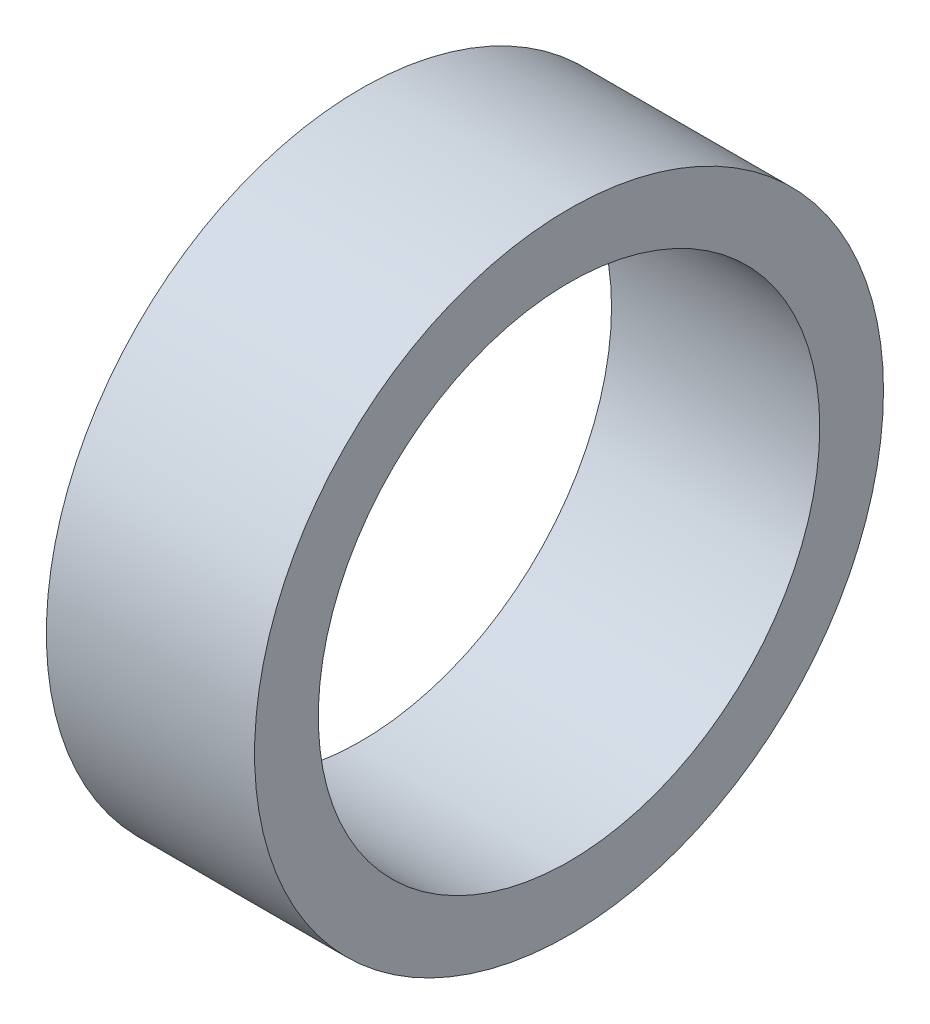
ISO-10303-21;
HEADER;
FILE_DESCRIPTION(('STEP AP214'),'2;1');
FILE_NAME('part.step','',(''),(''),'','','');
FILE_SCHEMA(('AUTOMOTIVE_DESIGN { 1 0 10303 214 1 1 1 1 }'));
ENDSEC;
DATA;
#1=APPLICATION_CONTEXT('core data for automotive mechanical design processes');
#2=APPLICATION_PROTOCOL_DEFINITION('international standard','automotive_design',2000,#1);
#3=PRODUCT_CONTEXT('',#1,'mechanical');
#4=PRODUCT('Part','Part','',(#3));
#5=PRODUCT_RELATED_PRODUCT_CATEGORY('part','',(#4));
#6=PRODUCT_DEFINITION_FORMATION('','',#4);
#7=PRODUCT_DEFINITION_CONTEXT('part definition',#1,'design');
#8=PRODUCT_DEFINITION('design','',#6,#7);
#9=PRODUCT_DEFINITION_SHAPE('','',#8);
#10=(LENGTH_UNIT() NAMED_UNIT(*) SI_UNIT(.MILLI.,.METRE.));
#11=(NAMED_UNIT(*) PLANE_ANGLE_UNIT() SI_UNIT($,.RADIAN.));
#12=(NAMED_UNIT(*) SI_UNIT($,.STERADIAN.) SOLID_ANGLE_UNIT());
#13=UNCERTAINTY_MEASURE_WITH_UNIT(LENGTH_MEASURE(1.E-05),#10,'distance_accuracy_value','');
#14=(GEOMETRIC_REPRESENTATION_CONTEXT(3) GLOBAL_UNCERTAINTY_ASSIGNED_CONTEXT((#13)) GLOBAL_UNIT_ASSIGNED_CONTEXT((#10,
#11,#12)) REPRESENTATION_CONTEXT('',''));
#15=CARTESIAN_POINT('',(0.,0.,0.));
#16=DIRECTION('',(0.,0.,1.));
#17=DIRECTION('',(1.,0.,0.));
#18=AXIS2_PLACEMENT_3D('',#15,#16,#17);
#19=CARTESIAN_POINT('',(2.4892,0.,0.));
#20=DIRECTION('',(1.,0.,0.));
#21=DIRECTION('',(0.,0.,-1.));
#22=AXIS2_PLACEMENT_3D('',#19,#20,#21);
#23=PLANE('',#22);
#24=CARTESIAN_POINT('',(2.4892,0.,0.));
#25=DIRECTION('',(1.,0.,0.));
#26=DIRECTION('',(0.,0.,-1.));
#27=AXIS2_PLACEMENT_3D('',#24,#25,#26);
#28=CIRCLE('',#27,3.7592);
#29=CARTESIAN_POINT('',(2.4892,0.,-3.7592));
#30=VERTEX_POINT('',#29);
#31=EDGE_CURVE('E10',#30,#30,#28,.T.);
#32=ORIENTED_EDGE('',*,*,#31,.T.);
#33=EDGE_LOOP('',(#32));
#34=FACE_BOUND('',#33,.T.);
#35=CARTESIAN_POINT('',(2.4892,0.,0.));
#36=DIRECTION('',(1.,0.,0.));
#37=DIRECTION('',(0.,0.,-1.));
#38=AXIS2_PLACEMENT_3D('',#35,#36,#37);
#39=CIRCLE('',#38,2.9972);
#40=CARTESIAN_POINT('',(2.4892,0.,-2.9972));
#41=VERTEX_POINT('',#40);
#42=EDGE_CURVE('E50',#41,#41,#39,.T.);
#43=ORIENTED_EDGE('',*,*,#42,.F.);
#44=EDGE_LOOP('',(#43));
#45=FACE_BOUND('',#44,.T.);
#46=ADVANCED_FACE('F39',(#34,#45),#23,.T.);
#47=CARTESIAN_POINT('',(0.,0.,0.));
#48=DIRECTION('',(1.,0.,0.));
#49=DIRECTION('',(0.,0.,-1.));
#50=AXIS2_PLACEMENT_3D('',#47,#48,#49);
#51=PLANE('',#50);
#52=CARTESIAN_POINT('',(0.,0.,0.));
#53=DIRECTION('',(1.,0.,0.));
#54=DIRECTION('',(0.,0.,-1.));
#55=AXIS2_PLACEMENT_3D('',#52,#53,#54);
#56=CIRCLE('',#55,3.7592);
#57=CARTESIAN_POINT('',(0.,0.,-3.7592));
#58=VERTEX_POINT('',#57);
#59=EDGE_CURVE('E43',#58,#58,#56,.T.);
#60=ORIENTED_EDGE('',*,*,#59,.F.);
#61=EDGE_LOOP('',(#60));
#62=FACE_BOUND('',#61,.T.);
#63=CARTESIAN_POINT('',(0.,0.,0.));
#64=DIRECTION('',(1.,0.,0.));
#65=DIRECTION('',(0.,0.,-1.));
#66=AXIS2_PLACEMENT_3D('',#63,#64,#65);
#67=CIRCLE('',#66,2.9972);
#68=CARTESIAN_POINT('',(0.,0.,-2.9972));
#69=VERTEX_POINT('',#68);
#70=EDGE_CURVE('E52',#69,#69,#67,.T.);
#71=ORIENTED_EDGE('',*,*,#70,.T.);
#72=EDGE_LOOP('',(#71));
#73=FACE_BOUND('',#72,.T.);
#74=ADVANCED_FACE('F62',(#62,#73),#51,.F.);
#75=CARTESIAN_POINT('',(2.4892,0.,0.));
#76=DIRECTION('',(-1.,0.,0.));
#77=DIRECTION('',(0.,0.,1.));
#78=AXIS2_PLACEMENT_3D('',#75,#76,#77);
#79=CYLINDRICAL_SURFACE('',#78,3.7592);
#80=ORIENTED_EDGE('',*,*,#31,.F.);
#81=EDGE_LOOP('',(#80));
#82=FACE_BOUND('',#81,.T.);
#83=ORIENTED_EDGE('',*,*,#59,.T.);
#84=EDGE_LOOP('',(#83));
#85=FACE_BOUND('',#84,.T.);
#86=ADVANCED_FACE('F41',(#82,#85),#79,.T.);
#87=CARTESIAN_POINT('',(2.4892,0.,0.));
#88=DIRECTION('',(-1.,0.,0.));
#89=DIRECTION('',(0.,0.,1.));
#90=AXIS2_PLACEMENT_3D('',#87,#88,#89);
#91=CYLINDRICAL_SURFACE('',#90,2.9972);
#92=ORIENTED_EDGE('',*,*,#42,.T.);
#93=EDGE_LOOP('',(#92));
#94=FACE_BOUND('',#93,.T.);
#95=ORIENTED_EDGE('',*,*,#70,.F.);
#96=EDGE_LOOP('',(#95));
#97=FACE_BOUND('',#96,.T.);
#98=ADVANCED_FACE('F58',(#94,#97),#91,.F.);
#99=CLOSED_SHELL('',(#46,#74,#86,#98));
#100=MANIFOLD_SOLID_BREP('B2',#99);
#101=ADVANCED_BREP_SHAPE_REPRESENTATION('',(#18,#100),#14);
#102=SHAPE_DEFINITION_REPRESENTATION(#9,#101);
ENDSEC;
END-ISO-10303-21;
